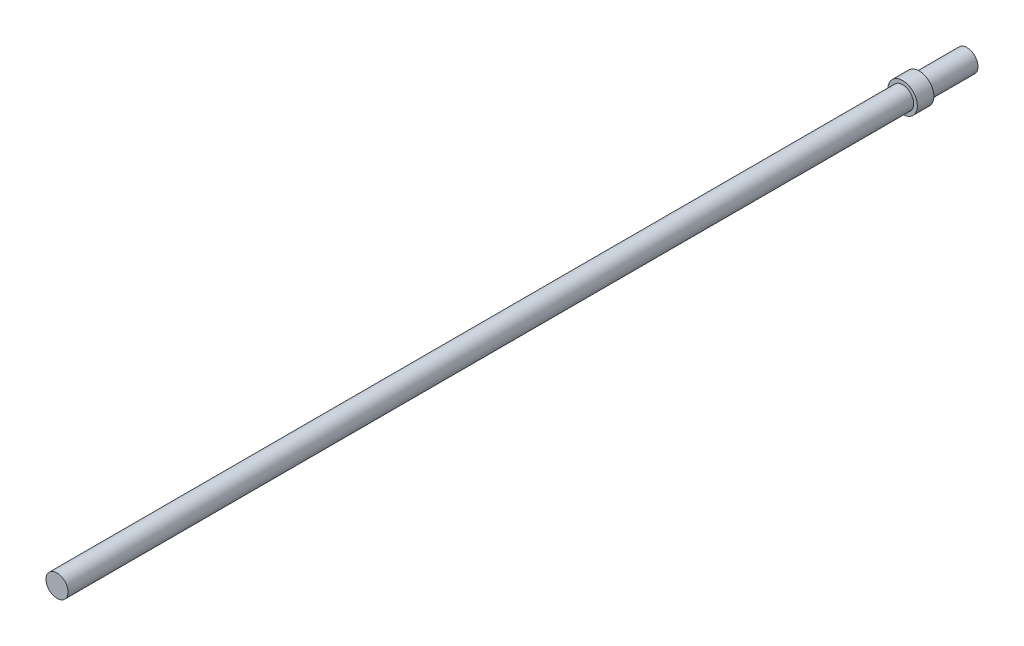
ISO-10303-21;
HEADER;
FILE_DESCRIPTION(('STEP AP214'),'2;1');
FILE_NAME('part.step','',(''),(''),'','','');
FILE_SCHEMA(('AUTOMOTIVE_DESIGN { 1 0 10303 214 1 1 1 1 }'));
ENDSEC;
DATA;
#1=APPLICATION_CONTEXT('core data for automotive mechanical design processes');
#2=APPLICATION_PROTOCOL_DEFINITION('international standard','automotive_design',2000,#1);
#3=PRODUCT_CONTEXT('',#1,'mechanical');
#4=PRODUCT('Part','Part','',(#3));
#5=PRODUCT_RELATED_PRODUCT_CATEGORY('part','',(#4));
#6=PRODUCT_DEFINITION_FORMATION('','',#4);
#7=PRODUCT_DEFINITION_CONTEXT('part definition',#1,'design');
#8=PRODUCT_DEFINITION('design','',#6,#7);
#9=PRODUCT_DEFINITION_SHAPE('','',#8);
#10=(LENGTH_UNIT() NAMED_UNIT(*) SI_UNIT(.MILLI.,.METRE.));
#11=(NAMED_UNIT(*) PLANE_ANGLE_UNIT() SI_UNIT($,.RADIAN.));
#12=(NAMED_UNIT(*) SI_UNIT($,.STERADIAN.) SOLID_ANGLE_UNIT());
#13=UNCERTAINTY_MEASURE_WITH_UNIT(LENGTH_MEASURE(1.E-05),#10,'distance_accuracy_value','');
#14=(GEOMETRIC_REPRESENTATION_CONTEXT(3) GLOBAL_UNCERTAINTY_ASSIGNED_CONTEXT((#13)) GLOBAL_UNIT_ASSIGNED_CONTEXT((#10,
#11,#12)) REPRESENTATION_CONTEXT('',''));
#15=CARTESIAN_POINT('',(0.,0.,0.));
#16=DIRECTION('',(0.,0.,1.));
#17=DIRECTION('',(1.,0.,0.));
#18=AXIS2_PLACEMENT_3D('',#15,#16,#17);
#19=CARTESIAN_POINT('',(0.,0.,230.));
#20=DIRECTION('',(0.,0.,-1.));
#21=DIRECTION('',(-1.,0.,0.));
#22=AXIS2_PLACEMENT_3D('',#19,#20,#21);
#23=CYLINDRICAL_SURFACE('',#22,3.);
#24=CARTESIAN_POINT('',(0.,0.,230.));
#25=DIRECTION('',(0.,0.,1.));
#26=DIRECTION('',(1.,0.,0.));
#27=AXIS2_PLACEMENT_3D('',#24,#25,#26);
#28=CIRCLE('',#27,3.);
#29=CARTESIAN_POINT('',(3.,0.,230.));
#30=VERTEX_POINT('',#29);
#31=EDGE_CURVE('E10',#30,#30,#28,.T.);
#32=ORIENTED_EDGE('',*,*,#31,.F.);
#33=EDGE_LOOP('',(#32));
#34=FACE_BOUND('',#33,.T.);
#35=CARTESIAN_POINT('',(0.,0.,0.));
#36=DIRECTION('',(0.,0.,1.));
#37=DIRECTION('',(1.,0.,0.));
#38=AXIS2_PLACEMENT_3D('',#35,#36,#37);
#39=CIRCLE('',#38,3.);
#40=CARTESIAN_POINT('',(3.,0.,0.));
#41=VERTEX_POINT('',#40);
#42=EDGE_CURVE('E37',#41,#41,#39,.T.);
#43=ORIENTED_EDGE('',*,*,#42,.T.);
#44=EDGE_LOOP('',(#43));
#45=FACE_BOUND('',#44,.T.);
#46=ADVANCED_FACE('F31',(#34,#45),#23,.T.);
#47=CARTESIAN_POINT('',(0.,0.,230.));
#48=DIRECTION('',(0.,0.,1.));
#49=DIRECTION('',(1.,0.,0.));
#50=AXIS2_PLACEMENT_3D('',#47,#48,#49);
#51=PLANE('',#50);
#52=ORIENTED_EDGE('',*,*,#31,.T.);
#53=EDGE_LOOP('',(#52));
#54=FACE_BOUND('',#53,.T.);
#55=ADVANCED_FACE('F69',(#54),#51,.T.);
#56=CARTESIAN_POINT('',(0.,0.,-4.5));
#57=DIRECTION('',(0.,0.,1.));
#58=DIRECTION('',(1.,0.,0.));
#59=AXIS2_PLACEMENT_3D('',#56,#57,#58);
#60=CYLINDRICAL_SURFACE('',#59,4.);
#61=CARTESIAN_POINT('',(0.,0.,-4.5));
#62=DIRECTION('',(0.,0.,1.));
#63=DIRECTION('',(1.,0.,0.));
#64=AXIS2_PLACEMENT_3D('',#61,#62,#63);
#65=CIRCLE('',#64,4.);
#66=CARTESIAN_POINT('',(4.,0.,-4.5));
#67=VERTEX_POINT('',#66);
#68=EDGE_CURVE('E41',#67,#67,#65,.T.);
#69=ORIENTED_EDGE('',*,*,#68,.T.);
#70=EDGE_LOOP('',(#69));
#71=FACE_BOUND('',#70,.T.);
#72=CARTESIAN_POINT('',(0.,0.,0.));
#73=DIRECTION('',(0.,0.,1.));
#74=DIRECTION('',(1.,0.,0.));
#75=AXIS2_PLACEMENT_3D('',#72,#73,#74);
#76=CIRCLE('',#75,4.);
#77=CARTESIAN_POINT('',(4.,0.,0.));
#78=VERTEX_POINT('',#77);
#79=EDGE_CURVE('E45',#78,#78,#76,.T.);
#80=ORIENTED_EDGE('',*,*,#79,.F.);
#81=EDGE_LOOP('',(#80));
#82=FACE_BOUND('',#81,.T.);
#83=ADVANCED_FACE('F74',(#71,#82),#60,.T.);
#84=CARTESIAN_POINT('',(0.,0.,-4.5));
#85=DIRECTION('',(0.,0.,1.));
#86=DIRECTION('',(1.,0.,0.));
#87=AXIS2_PLACEMENT_3D('',#84,#85,#86);
#88=PLANE('',#87);
#89=CARTESIAN_POINT('',(0.,0.,-4.5));
#90=DIRECTION('',(0.,0.,1.));
#91=DIRECTION('',(1.,0.,0.));
#92=AXIS2_PLACEMENT_3D('',#89,#90,#91);
#93=CIRCLE('',#92,3.);
#94=CARTESIAN_POINT('',(3.,0.,-4.5));
#95=VERTEX_POINT('',#94);
#96=EDGE_CURVE('E49',#95,#95,#93,.T.);
#97=ORIENTED_EDGE('',*,*,#96,.T.);
#98=EDGE_LOOP('',(#97));
#99=FACE_BOUND('',#98,.T.);
#100=ORIENTED_EDGE('',*,*,#68,.F.);
#101=EDGE_LOOP('',(#100));
#102=FACE_BOUND('',#101,.T.);
#103=ADVANCED_FACE('F78',(#99,#102),#88,.F.);
#104=CARTESIAN_POINT('',(0.,0.,0.));
#105=DIRECTION('',(0.,0.,1.));
#106=DIRECTION('',(1.,0.,0.));
#107=AXIS2_PLACEMENT_3D('',#104,#105,#106);
#108=PLANE('',#107);
#109=ORIENTED_EDGE('',*,*,#42,.F.);
#110=EDGE_LOOP('',(#109));
#111=FACE_BOUND('',#110,.T.);
#112=ORIENTED_EDGE('',*,*,#79,.T.);
#113=EDGE_LOOP('',(#112));
#114=FACE_BOUND('',#113,.T.);
#115=ADVANCED_FACE('F66',(#111,#114),#108,.T.);
#116=CARTESIAN_POINT('',(0.,0.,-17.5));
#117=DIRECTION('',(0.,0.,1.));
#118=DIRECTION('',(1.,0.,0.));
#119=AXIS2_PLACEMENT_3D('',#116,#117,#118);
#120=CYLINDRICAL_SURFACE('',#119,3.);
#121=CARTESIAN_POINT('',(0.,0.,-17.5));
#122=DIRECTION('',(0.,0.,1.));
#123=DIRECTION('',(1.,0.,0.));
#124=AXIS2_PLACEMENT_3D('',#121,#122,#123);
#125=CIRCLE('',#124,3.);
#126=CARTESIAN_POINT('',(3.,0.,-17.5));
#127=VERTEX_POINT('',#126);
#128=EDGE_CURVE('E53',#127,#127,#125,.T.);
#129=ORIENTED_EDGE('',*,*,#128,.T.);
#130=EDGE_LOOP('',(#129));
#131=FACE_BOUND('',#130,.T.);
#132=ORIENTED_EDGE('',*,*,#96,.F.);
#133=EDGE_LOOP('',(#132));
#134=FACE_BOUND('',#133,.T.);
#135=ADVANCED_FACE('F57',(#131,#134),#120,.T.);
#136=CARTESIAN_POINT('',(0.,0.,-17.5));
#137=DIRECTION('',(0.,0.,1.));
#138=DIRECTION('',(1.,0.,0.));
#139=AXIS2_PLACEMENT_3D('',#136,#137,#138);
#140=PLANE('',#139);
#141=ORIENTED_EDGE('',*,*,#128,.F.);
#142=EDGE_LOOP('',(#141));
#143=FACE_BOUND('',#142,.T.);
#144=ADVANCED_FACE('F60',(#143),#140,.F.);
#145=CLOSED_SHELL('',(#46,#55,#83,#103,#115,#135,#144));
#146=MANIFOLD_SOLID_BREP('B2',#145);
#147=ADVANCED_BREP_SHAPE_REPRESENTATION('',(#18,#146),#14);
#148=SHAPE_DEFINITION_REPRESENTATION(#9,#147);
ENDSEC;
END-ISO-10303-21;
